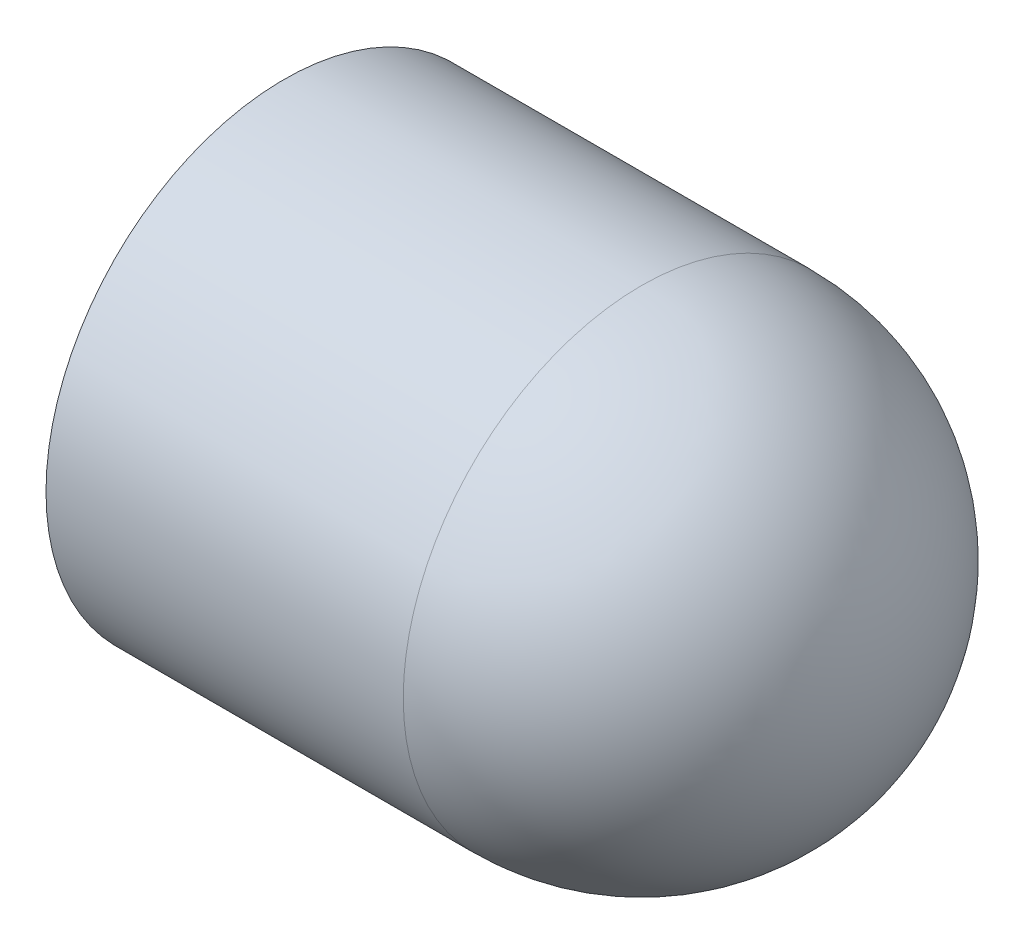
ISO-10303-21;
HEADER;
FILE_DESCRIPTION(('STEP AP214'),'2;1');
FILE_NAME('part.step','',(''),(''),'','','');
FILE_SCHEMA(('AUTOMOTIVE_DESIGN { 1 0 10303 214 1 1 1 1 }'));
ENDSEC;
DATA;
#1=APPLICATION_CONTEXT('core data for automotive mechanical design processes');
#2=APPLICATION_PROTOCOL_DEFINITION('international standard','automotive_design',2000,#1);
#3=PRODUCT_CONTEXT('',#1,'mechanical');
#4=PRODUCT('Part','Part','',(#3));
#5=PRODUCT_RELATED_PRODUCT_CATEGORY('part','',(#4));
#6=PRODUCT_DEFINITION_FORMATION('','',#4);
#7=PRODUCT_DEFINITION_CONTEXT('part definition',#1,'design');
#8=PRODUCT_DEFINITION('design','',#6,#7);
#9=PRODUCT_DEFINITION_SHAPE('','',#8);
#10=(LENGTH_UNIT() NAMED_UNIT(*) SI_UNIT(.MILLI.,.METRE.));
#11=(NAMED_UNIT(*) PLANE_ANGLE_UNIT() SI_UNIT($,.RADIAN.));
#12=(NAMED_UNIT(*) SI_UNIT($,.STERADIAN.) SOLID_ANGLE_UNIT());
#13=UNCERTAINTY_MEASURE_WITH_UNIT(LENGTH_MEASURE(1.E-05),#10,'distance_accuracy_value','');
#14=(GEOMETRIC_REPRESENTATION_CONTEXT(3) GLOBAL_UNCERTAINTY_ASSIGNED_CONTEXT((#13)) GLOBAL_UNIT_ASSIGNED_CONTEXT((#10,
#11,#12)) REPRESENTATION_CONTEXT('',''));
#15=CARTESIAN_POINT('',(0.,0.,0.));
#16=DIRECTION('',(0.,0.,1.));
#17=DIRECTION('',(1.,0.,0.));
#18=AXIS2_PLACEMENT_3D('',#15,#16,#17);
#19=CARTESIAN_POINT('',(4.35889894354067,0.,0.));
#20=DIRECTION('',(1.,0.,0.));
#21=DIRECTION('',(0.,0.,-1.));
#22=AXIS2_PLACEMENT_3D('',#19,#20,#21);
#23=PLANE('',#22);
#24=CARTESIAN_POINT('',(4.35889894354067,0.,0.));
#25=DIRECTION('',(-1.,0.,0.));
#26=DIRECTION('',(0.,0.,1.));
#27=AXIS2_PLACEMENT_3D('',#24,#25,#26);
#28=CIRCLE('',#27,9.);
#29=CARTESIAN_POINT('',(4.35889894354067,0.,9.));
#30=VERTEX_POINT('',#29);
#31=EDGE_CURVE('E48',#30,#30,#28,.T.);
#32=ORIENTED_EDGE('',*,*,#31,.F.);
#33=EDGE_LOOP('',(#32));
#34=FACE_BOUND('',#33,.T.);
#35=CARTESIAN_POINT('',(4.35889894354067,0.,0.));
#36=DIRECTION('',(-1.,0.,0.));
#37=DIRECTION('',(0.,0.,1.));
#38=AXIS2_PLACEMENT_3D('',#35,#36,#37);
#39=CIRCLE('',#38,10.);
#40=CARTESIAN_POINT('',(4.35889894354067,0.,10.));
#41=VERTEX_POINT('',#40);
#42=EDGE_CURVE('E44',#41,#41,#39,.T.);
#43=ORIENTED_EDGE('',*,*,#42,.T.);
#44=EDGE_LOOP('',(#43));
#45=FACE_BOUND('',#44,.T.);
#46=ADVANCED_FACE('F37',(#34,#45),#23,.F.);
#47=CARTESIAN_POINT('',(0.,0.,0.));
#48=DIRECTION('',(-1.,0.,0.));
#49=DIRECTION('',(0.,1.,0.));
#50=AXIS2_PLACEMENT_3D('',#47,#48,#49);
#51=SPHERICAL_SURFACE('',#50,10.);
#52=ORIENTED_EDGE('',*,*,#31,.T.);
#53=EDGE_LOOP('',(#52));
#54=FACE_BOUND('',#53,.T.);
#55=ADVANCED_FACE('F55',(#54),#51,.F.);
#56=CARTESIAN_POINT('',(10.,0.,0.));
#57=DIRECTION('',(-1.,0.,0.));
#58=DIRECTION('',(0.,0.,1.));
#59=AXIS2_PLACEMENT_3D('',#56,#57,#58);
#60=CYLINDRICAL_SURFACE('',#59,10.);
#61=CARTESIAN_POINT('',(19.3588989435407,0.,0.));
#62=DIRECTION('',(-1.,0.,0.));
#63=DIRECTION('',(0.,0.,1.));
#64=AXIS2_PLACEMENT_3D('',#61,#62,#63);
#65=CIRCLE('',#64,10.);
#66=CARTESIAN_POINT('',(19.3588989435407,0.,10.));
#67=VERTEX_POINT('',#66);
#68=EDGE_CURVE('E10',#67,#67,#65,.T.);
#69=ORIENTED_EDGE('',*,*,#68,.T.);
#70=EDGE_LOOP('',(#69));
#71=FACE_BOUND('',#70,.T.);
#72=ORIENTED_EDGE('',*,*,#42,.F.);
#73=EDGE_LOOP('',(#72));
#74=FACE_BOUND('',#73,.T.);
#75=ADVANCED_FACE('F59',(#71,#74),#60,.T.);
#76=CARTESIAN_POINT('',(19.3588989435407,0.,0.));
#77=DIRECTION('',(-1.,0.,0.));
#78=DIRECTION('',(0.,1.,0.));
#79=AXIS2_PLACEMENT_3D('',#76,#77,#78);
#80=SPHERICAL_SURFACE('',#79,10.);
#81=ORIENTED_EDGE('',*,*,#68,.F.);
#82=EDGE_LOOP('',(#81));
#83=FACE_BOUND('',#82,.T.);
#84=ADVANCED_FACE('F39',(#83),#80,.T.);
#85=CLOSED_SHELL('',(#46,#55,#75,#84));
#86=MANIFOLD_SOLID_BREP('B2',#85);
#87=ADVANCED_BREP_SHAPE_REPRESENTATION('',(#18,#86),#14);
#88=SHAPE_DEFINITION_REPRESENTATION(#9,#87);
ENDSEC;
END-ISO-10303-21;
